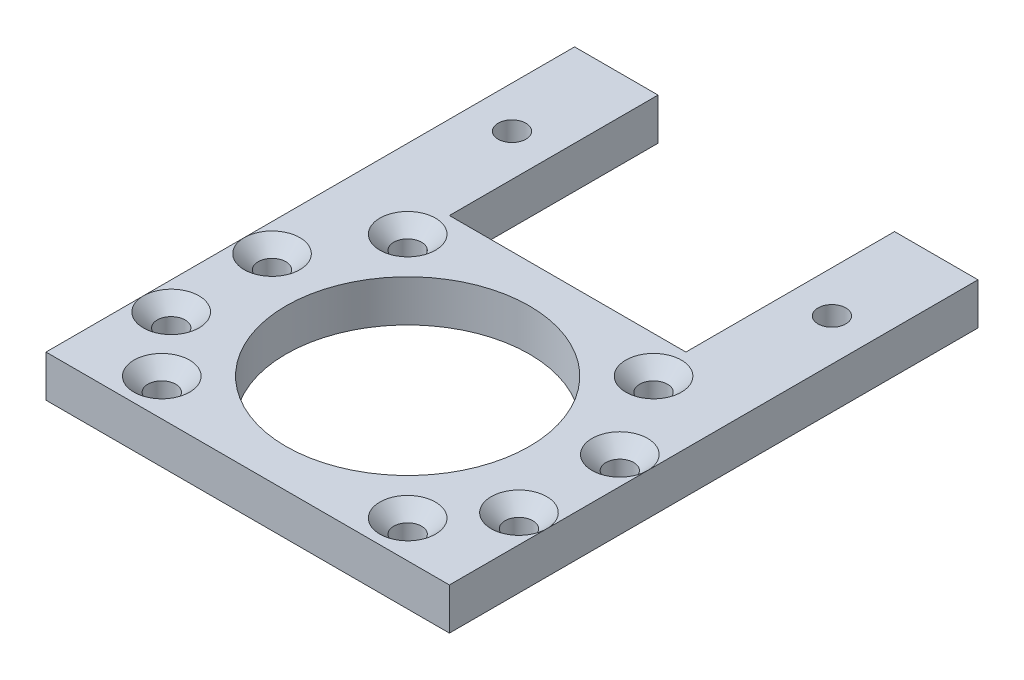
ISO-10303-21;
HEADER;
FILE_DESCRIPTION(('STEP AP214'),'2;1');
FILE_NAME('part.step','',(''),(''),'','','');
FILE_SCHEMA(('AUTOMOTIVE_DESIGN { 1 0 10303 214 1 1 1 1 }'));
ENDSEC;
DATA;
#1=APPLICATION_CONTEXT('core data for automotive mechanical design processes');
#2=APPLICATION_PROTOCOL_DEFINITION('international standard','automotive_design',2000,#1);
#3=PRODUCT_CONTEXT('',#1,'mechanical');
#4=PRODUCT('Part','Part','',(#3));
#5=PRODUCT_RELATED_PRODUCT_CATEGORY('part','',(#4));
#6=PRODUCT_DEFINITION_FORMATION('','',#4);
#7=PRODUCT_DEFINITION_CONTEXT('part definition',#1,'design');
#8=PRODUCT_DEFINITION('design','',#6,#7);
#9=PRODUCT_DEFINITION_SHAPE('','',#8);
#10=(LENGTH_UNIT() NAMED_UNIT(*) SI_UNIT(.MILLI.,.METRE.));
#11=(NAMED_UNIT(*) PLANE_ANGLE_UNIT() SI_UNIT($,.RADIAN.));
#12=(NAMED_UNIT(*) SI_UNIT($,.STERADIAN.) SOLID_ANGLE_UNIT());
#13=UNCERTAINTY_MEASURE_WITH_UNIT(LENGTH_MEASURE(1.E-05),#10,'distance_accuracy_value','');
#14=(GEOMETRIC_REPRESENTATION_CONTEXT(3) GLOBAL_UNCERTAINTY_ASSIGNED_CONTEXT((#13)) GLOBAL_UNIT_ASSIGNED_CONTEXT((#10,
#11,#12)) REPRESENTATION_CONTEXT('',''));
#15=CARTESIAN_POINT('',(0.,0.,0.));
#16=DIRECTION('',(0.,0.,1.));
#17=DIRECTION('',(1.,0.,0.));
#18=AXIS2_PLACEMENT_3D('',#15,#16,#17);
#19=CARTESIAN_POINT('',(0.,6.,-23.));
#20=DIRECTION('',(0.,0.,-1.));
#21=DIRECTION('',(-1.,0.,0.));
#22=AXIS2_PLACEMENT_3D('',#19,#20,#21);
#23=PLANE('',#22);
#24=DIRECTION('',(1.,0.,0.));
#25=VECTOR('',#24,1.);
#26=CARTESIAN_POINT('',(0.,6.,-23.));
#27=LINE('',#26,#25);
#28=CARTESIAN_POINT('',(-17.,6.,-23.));
#29=VERTEX_POINT('',#28);
#30=CARTESIAN_POINT('',(17.,6.,-23.));
#31=VERTEX_POINT('',#30);
#32=EDGE_CURVE('E132',#29,#31,#27,.T.);
#33=ORIENTED_EDGE('',*,*,#32,.T.);
#34=DIRECTION('',(0.,-1.,0.));
#35=VECTOR('',#34,1.);
#36=CARTESIAN_POINT('',(17.,38.310988842807,-23.));
#37=LINE('',#36,#35);
#38=CARTESIAN_POINT('',(17.,0.,-23.));
#39=VERTEX_POINT('',#38);
#40=EDGE_CURVE('E114',#31,#39,#37,.T.);
#41=ORIENTED_EDGE('',*,*,#40,.T.);
#42=DIRECTION('',(1.,0.,0.));
#43=VECTOR('',#42,1.);
#44=CARTESIAN_POINT('',(0.,0.,-23.));
#45=LINE('',#44,#43);
#46=CARTESIAN_POINT('',(-17.,0.,-23.));
#47=VERTEX_POINT('',#46);
#48=EDGE_CURVE('E181',#47,#39,#45,.T.);
#49=ORIENTED_EDGE('',*,*,#48,.F.);
#50=DIRECTION('',(0.,-1.,0.));
#51=VECTOR('',#50,1.);
#52=CARTESIAN_POINT('',(-17.,38.310988842807,-23.));
#53=LINE('',#52,#51);
#54=EDGE_CURVE('E139',#29,#47,#53,.T.);
#55=ORIENTED_EDGE('',*,*,#54,.F.);
#56=EDGE_LOOP('',(#33,#41,#49,#55));
#57=FACE_BOUND('',#56,.T.);
#58=ADVANCED_FACE('F38',(#57),#23,.T.);
#59=CARTESIAN_POINT('',(29.,6.,0.));
#60=DIRECTION('',(1.,0.,0.));
#61=DIRECTION('',(0.,0.,-1.));
#62=AXIS2_PLACEMENT_3D('',#59,#60,#61);
#63=PLANE('',#62);
#64=DIRECTION('',(0.,0.,1.));
#65=VECTOR('',#64,1.);
#66=CARTESIAN_POINT('',(29.,0.,0.));
#67=LINE('',#66,#65);
#68=CARTESIAN_POINT('',(29.,0.,-53.));
#69=VERTEX_POINT('',#68);
#70=CARTESIAN_POINT('',(29.,0.,23.));
#71=VERTEX_POINT('',#70);
#72=EDGE_CURVE('E178',#69,#71,#67,.T.);
#73=ORIENTED_EDGE('',*,*,#72,.F.);
#74=DIRECTION('',(0.,-1.,0.));
#75=VECTOR('',#74,1.);
#76=CARTESIAN_POINT('',(29.,38.310988842807,-53.));
#77=LINE('',#76,#75);
#78=CARTESIAN_POINT('',(29.,6.,-53.));
#79=VERTEX_POINT('',#78);
#80=EDGE_CURVE('E375',#79,#69,#77,.T.);
#81=ORIENTED_EDGE('',*,*,#80,.F.);
#82=DIRECTION('',(0.,0.,1.));
#83=VECTOR('',#82,1.);
#84=CARTESIAN_POINT('',(29.,6.,0.));
#85=LINE('',#84,#83);
#86=CARTESIAN_POINT('',(29.,6.,-5.50000000000001));
#87=VERTEX_POINT('',#86);
#88=EDGE_CURVE('E141',#79,#87,#85,.T.);
#89=ORIENTED_EDGE('',*,*,#88,.T.);
#90=CARTESIAN_POINT('',(29.,6.,8.99999999999999));
#91=VERTEX_POINT('',#90);
#92=EDGE_CURVE('E147',#87,#91,#85,.T.);
#93=ORIENTED_EDGE('',*,*,#92,.T.);
#94=CARTESIAN_POINT('',(29.,6.,23.));
#95=VERTEX_POINT('',#94);
#96=EDGE_CURVE('E149',#91,#95,#85,.T.);
#97=ORIENTED_EDGE('',*,*,#96,.T.);
#98=DIRECTION('',(0.,-1.,0.));
#99=VECTOR('',#98,1.);
#100=CARTESIAN_POINT('',(29.,6.,23.));
#101=LINE('',#100,#99);
#102=EDGE_CURVE('E156',#95,#71,#101,.T.);
#103=ORIENTED_EDGE('',*,*,#102,.T.);
#104=EDGE_LOOP('',(#73,#81,#89,#93,#97,#103));
#105=FACE_BOUND('',#104,.T.);
#106=ADVANCED_FACE('F255',(#105),#63,.T.);
#107=CARTESIAN_POINT('',(-29.,6.,0.));
#108=DIRECTION('',(1.,0.,0.));
#109=DIRECTION('',(0.,0.,-1.));
#110=AXIS2_PLACEMENT_3D('',#107,#108,#109);
#111=PLANE('',#110);
#112=DIRECTION('',(0.,0.,1.));
#113=VECTOR('',#112,1.);
#114=CARTESIAN_POINT('',(-29.,0.,0.));
#115=LINE('',#114,#113);
#116=CARTESIAN_POINT('',(-29.,0.,-53.));
#117=VERTEX_POINT('',#116);
#118=CARTESIAN_POINT('',(-29.,0.,23.));
#119=VERTEX_POINT('',#118);
#120=EDGE_CURVE('E183',#117,#119,#115,.T.);
#121=ORIENTED_EDGE('',*,*,#120,.T.);
#122=DIRECTION('',(0.,-1.,0.));
#123=VECTOR('',#122,1.);
#124=CARTESIAN_POINT('',(-29.,6.,23.));
#125=LINE('',#124,#123);
#126=CARTESIAN_POINT('',(-29.,6.,23.));
#127=VERTEX_POINT('',#126);
#128=EDGE_CURVE('E197',#127,#119,#125,.T.);
#129=ORIENTED_EDGE('',*,*,#128,.F.);
#130=DIRECTION('',(0.,0.,1.));
#131=VECTOR('',#130,1.);
#132=CARTESIAN_POINT('',(-29.,6.,0.));
#133=LINE('',#132,#131);
#134=CARTESIAN_POINT('',(-29.,6.,9.));
#135=VERTEX_POINT('',#134);
#136=EDGE_CURVE('E140',#135,#127,#133,.T.);
#137=ORIENTED_EDGE('',*,*,#136,.F.);
#138=CARTESIAN_POINT('',(-29.,6.,-5.5));
#139=VERTEX_POINT('',#138);
#140=EDGE_CURVE('E143',#139,#135,#133,.T.);
#141=ORIENTED_EDGE('',*,*,#140,.F.);
#142=CARTESIAN_POINT('',(-29.,6.,-53.));
#143=VERTEX_POINT('',#142);
#144=EDGE_CURVE('E145',#143,#139,#133,.T.);
#145=ORIENTED_EDGE('',*,*,#144,.F.);
#146=DIRECTION('',(0.,-1.,0.));
#147=VECTOR('',#146,1.);
#148=CARTESIAN_POINT('',(-29.,38.310988842807,-53.));
#149=LINE('',#148,#147);
#150=EDGE_CURVE('E393',#143,#117,#149,.T.);
#151=ORIENTED_EDGE('',*,*,#150,.T.);
#152=EDGE_LOOP('',(#121,#129,#137,#141,#145,#151));
#153=FACE_BOUND('',#152,.T.);
#154=ADVANCED_FACE('F260',(#153),#111,.F.);
#155=CARTESIAN_POINT('',(17.6776695296637,6.,17.6776695296637));
#156=DIRECTION('',(0.,-1.,0.));
#157=DIRECTION('',(0.,0.,-1.));
#158=AXIS2_PLACEMENT_3D('',#155,#156,#157);
#159=CYLINDRICAL_SURFACE('',#158,2.00000000000001);
#160=CARTESIAN_POINT('',(17.6776695296637,4.,17.6776695296637));
#161=DIRECTION('',(0.,1.,0.));
#162=DIRECTION('',(0.,0.,1.));
#163=AXIS2_PLACEMENT_3D('',#160,#161,#162);
#164=CIRCLE('',#163,2.00000000000001);
#165=CARTESIAN_POINT('',(17.6776695296637,4.,19.6776695296637));
#166=VERTEX_POINT('',#165);
#167=EDGE_CURVE('E229',#166,#166,#164,.T.);
#168=ORIENTED_EDGE('',*,*,#167,.T.);
#169=EDGE_LOOP('',(#168));
#170=FACE_BOUND('',#169,.T.);
#171=CARTESIAN_POINT('',(17.6776695296637,0.,17.6776695296637));
#172=DIRECTION('',(0.,1.,0.));
#173=DIRECTION('',(0.,0.,1.));
#174=AXIS2_PLACEMENT_3D('',#171,#172,#173);
#175=CIRCLE('',#174,2.00000000000001);
#176=CARTESIAN_POINT('',(17.6776695296637,0.,19.6776695296637));
#177=VERTEX_POINT('',#176);
#178=EDGE_CURVE('E189',#177,#177,#175,.F.);
#179=ORIENTED_EDGE('',*,*,#178,.T.);
#180=EDGE_LOOP('',(#179));
#181=FACE_BOUND('',#180,.T.);
#182=ADVANCED_FACE('F424',(#170,#181),#159,.F.);
#183=CARTESIAN_POINT('',(0.,6.,23.));
#184=DIRECTION('',(0.,0.,-1.));
#185=DIRECTION('',(-1.,0.,0.));
#186=AXIS2_PLACEMENT_3D('',#183,#184,#185);
#187=PLANE('',#186);
#188=DIRECTION('',(1.,0.,0.));
#189=VECTOR('',#188,1.);
#190=CARTESIAN_POINT('',(0.,0.,23.));
#191=LINE('',#190,#189);
#192=EDGE_CURVE('E186',#119,#71,#191,.T.);
#193=ORIENTED_EDGE('',*,*,#192,.T.);
#194=ORIENTED_EDGE('',*,*,#102,.F.);
#195=DIRECTION('',(1.,0.,0.));
#196=VECTOR('',#195,1.);
#197=CARTESIAN_POINT('',(0.,6.,23.));
#198=LINE('',#197,#196);
#199=EDGE_CURVE('E153',#127,#95,#198,.T.);
#200=ORIENTED_EDGE('',*,*,#199,.F.);
#201=ORIENTED_EDGE('',*,*,#128,.T.);
#202=EDGE_LOOP('',(#193,#194,#200,#201));
#203=FACE_BOUND('',#202,.T.);
#204=ADVANCED_FACE('F270',(#203),#187,.F.);
#205=CARTESIAN_POINT('',(0.,6.,0.));
#206=DIRECTION('',(0.,-1.,0.));
#207=DIRECTION('',(0.,0.,-1.));
#208=AXIS2_PLACEMENT_3D('',#205,#206,#207);
#209=CYLINDRICAL_SURFACE('',#208,17.5);
#210=CARTESIAN_POINT('',(0.,6.,0.));
#211=DIRECTION('',(0.,1.,0.));
#212=DIRECTION('',(0.,0.,1.));
#213=AXIS2_PLACEMENT_3D('',#210,#211,#212);
#214=CIRCLE('',#213,17.5);
#215=CARTESIAN_POINT('',(0.,6.,17.5));
#216=VERTEX_POINT('',#215);
#217=EDGE_CURVE('E195',#216,#216,#214,.T.);
#218=ORIENTED_EDGE('',*,*,#217,.T.);
#219=EDGE_LOOP('',(#218));
#220=FACE_BOUND('',#219,.T.);
#221=CARTESIAN_POINT('',(0.,0.,0.));
#222=DIRECTION('',(0.,1.,0.));
#223=DIRECTION('',(0.,0.,1.));
#224=AXIS2_PLACEMENT_3D('',#221,#222,#223);
#225=CIRCLE('',#224,17.5);
#226=CARTESIAN_POINT('',(0.,0.,17.5));
#227=VERTEX_POINT('',#226);
#228=EDGE_CURVE('E175',#227,#227,#225,.T.);
#229=ORIENTED_EDGE('',*,*,#228,.F.);
#230=EDGE_LOOP('',(#229));
#231=FACE_BOUND('',#230,.T.);
#232=ADVANCED_FACE('F266',(#220,#231),#209,.F.);
#233=CARTESIAN_POINT('',(-17.6776695296637,6.,-17.6776695296637));
#234=DIRECTION('',(0.,-1.,0.));
#235=DIRECTION('',(0.,0.,-1.));
#236=AXIS2_PLACEMENT_3D('',#233,#234,#235);
#237=CYLINDRICAL_SURFACE('',#236,2.);
#238=CARTESIAN_POINT('',(-17.6776695296637,3.99999999999997,-17.6776695296637));
#239=DIRECTION('',(0.,1.,0.));
#240=DIRECTION('',(0.,0.,1.));
#241=AXIS2_PLACEMENT_3D('',#238,#239,#240);
#242=CIRCLE('',#241,2.);
#243=CARTESIAN_POINT('',(-17.6776695296637,3.99999999999997,-15.6776695296637));
#244=VERTEX_POINT('',#243);
#245=EDGE_CURVE('E11',#244,#244,#242,.T.);
#246=ORIENTED_EDGE('',*,*,#245,.T.);
#247=EDGE_LOOP('',(#246));
#248=FACE_BOUND('',#247,.T.);
#249=CARTESIAN_POINT('',(-17.6776695296637,0.,-17.6776695296637));
#250=DIRECTION('',(0.,1.,0.));
#251=DIRECTION('',(0.,0.,1.));
#252=AXIS2_PLACEMENT_3D('',#249,#250,#251);
#253=CIRCLE('',#252,2.);
#254=CARTESIAN_POINT('',(-17.6776695296637,0.,-15.6776695296637));
#255=VERTEX_POINT('',#254);
#256=EDGE_CURVE('E172',#255,#255,#253,.T.);
#257=ORIENTED_EDGE('',*,*,#256,.F.);
#258=EDGE_LOOP('',(#257));
#259=FACE_BOUND('',#258,.T.);
#260=ADVANCED_FACE('F269',(#248,#259),#237,.F.);
#261=CARTESIAN_POINT('',(-17.6776695296637,6.,17.6776695296637));
#262=DIRECTION('',(0.,-1.,0.));
#263=DIRECTION('',(0.,0.,-1.));
#264=AXIS2_PLACEMENT_3D('',#261,#262,#263);
#265=CYLINDRICAL_SURFACE('',#264,2.);
#266=CARTESIAN_POINT('',(-17.6776695296637,3.99999999999998,17.6776695296637));
#267=DIRECTION('',(0.,1.,0.));
#268=DIRECTION('',(0.,0.,1.));
#269=AXIS2_PLACEMENT_3D('',#266,#267,#268);
#270=CIRCLE('',#269,2.);
#271=CARTESIAN_POINT('',(-17.6776695296637,3.99999999999998,19.6776695296637));
#272=VERTEX_POINT('',#271);
#273=EDGE_CURVE('E232',#272,#272,#270,.T.);
#274=ORIENTED_EDGE('',*,*,#273,.T.);
#275=EDGE_LOOP('',(#274));
#276=FACE_BOUND('',#275,.T.);
#277=CARTESIAN_POINT('',(-17.6776695296637,0.,17.6776695296637));
#278=DIRECTION('',(0.,1.,0.));
#279=DIRECTION('',(0.,0.,1.));
#280=AXIS2_PLACEMENT_3D('',#277,#278,#279);
#281=CIRCLE('',#280,2.);
#282=CARTESIAN_POINT('',(-17.6776695296637,0.,19.6776695296637));
#283=VERTEX_POINT('',#282);
#284=EDGE_CURVE('E169',#283,#283,#281,.T.);
#285=ORIENTED_EDGE('',*,*,#284,.F.);
#286=EDGE_LOOP('',(#285));
#287=FACE_BOUND('',#286,.T.);
#288=ADVANCED_FACE('F274',(#276,#287),#265,.F.);
#289=CARTESIAN_POINT('',(17.6776695296637,6.,-17.6776695296637));
#290=DIRECTION('',(0.,-1.,0.));
#291=DIRECTION('',(0.,0.,-1.));
#292=AXIS2_PLACEMENT_3D('',#289,#290,#291);
#293=CYLINDRICAL_SURFACE('',#292,2.00000000000001);
#294=CARTESIAN_POINT('',(17.6776695296637,4.,-17.6776695296637));
#295=DIRECTION('',(0.,1.,0.));
#296=DIRECTION('',(0.,0.,1.));
#297=AXIS2_PLACEMENT_3D('',#294,#295,#296);
#298=CIRCLE('',#297,2.00000000000001);
#299=CARTESIAN_POINT('',(17.6776695296637,4.,-15.6776695296637));
#300=VERTEX_POINT('',#299);
#301=EDGE_CURVE('E220',#300,#300,#298,.T.);
#302=ORIENTED_EDGE('',*,*,#301,.T.);
#303=EDGE_LOOP('',(#302));
#304=FACE_BOUND('',#303,.T.);
#305=CARTESIAN_POINT('',(17.6776695296637,0.,-17.6776695296637));
#306=DIRECTION('',(0.,1.,0.));
#307=DIRECTION('',(0.,0.,1.));
#308=AXIS2_PLACEMENT_3D('',#305,#306,#307);
#309=CIRCLE('',#308,2.00000000000001);
#310=CARTESIAN_POINT('',(17.6776695296637,0.,-15.6776695296637));
#311=VERTEX_POINT('',#310);
#312=EDGE_CURVE('E166',#311,#311,#309,.F.);
#313=ORIENTED_EDGE('',*,*,#312,.T.);
#314=EDGE_LOOP('',(#313));
#315=FACE_BOUND('',#314,.T.);
#316=ADVANCED_FACE('F278',(#304,#315),#293,.F.);
#317=CARTESIAN_POINT('',(-25.,6.,-5.5));
#318=DIRECTION('',(0.,-1.,0.));
#319=DIRECTION('',(0.,0.,-1.));
#320=AXIS2_PLACEMENT_3D('',#317,#318,#319);
#321=CYLINDRICAL_SURFACE('',#320,2.);
#322=CARTESIAN_POINT('',(-25.,3.99999999999998,-5.5));
#323=DIRECTION('',(0.,1.,0.));
#324=DIRECTION('',(0.,0.,1.));
#325=AXIS2_PLACEMENT_3D('',#322,#323,#324);
#326=CIRCLE('',#325,2.);
#327=CARTESIAN_POINT('',(-25.,3.99999999999998,-3.5));
#328=VERTEX_POINT('',#327);
#329=EDGE_CURVE('E47',#328,#328,#326,.T.);
#330=ORIENTED_EDGE('',*,*,#329,.T.);
#331=EDGE_LOOP('',(#330));
#332=FACE_BOUND('',#331,.T.);
#333=CARTESIAN_POINT('',(-25.,0.,-5.5));
#334=DIRECTION('',(0.,1.,0.));
#335=DIRECTION('',(0.,0.,1.));
#336=AXIS2_PLACEMENT_3D('',#333,#334,#335);
#337=CIRCLE('',#336,2.);
#338=CARTESIAN_POINT('',(-25.,0.,-3.5));
#339=VERTEX_POINT('',#338);
#340=EDGE_CURVE('E163',#339,#339,#337,.T.);
#341=ORIENTED_EDGE('',*,*,#340,.F.);
#342=EDGE_LOOP('',(#341));
#343=FACE_BOUND('',#342,.T.);
#344=ADVANCED_FACE('F240',(#332,#343),#321,.F.);
#345=CARTESIAN_POINT('',(-25.,6.,9.));
#346=DIRECTION('',(0.,-1.,0.));
#347=DIRECTION('',(0.,0.,-1.));
#348=AXIS2_PLACEMENT_3D('',#345,#346,#347);
#349=CYLINDRICAL_SURFACE('',#348,2.);
#350=CARTESIAN_POINT('',(-25.,3.99999999999998,9.));
#351=DIRECTION('',(0.,1.,0.));
#352=DIRECTION('',(0.,0.,1.));
#353=AXIS2_PLACEMENT_3D('',#350,#351,#352);
#354=CIRCLE('',#353,2.);
#355=CARTESIAN_POINT('',(-25.,3.99999999999998,11.));
#356=VERTEX_POINT('',#355);
#357=EDGE_CURVE('E235',#356,#356,#354,.T.);
#358=ORIENTED_EDGE('',*,*,#357,.T.);
#359=EDGE_LOOP('',(#358));
#360=FACE_BOUND('',#359,.T.);
#361=CARTESIAN_POINT('',(-25.,0.,9.));
#362=DIRECTION('',(0.,1.,0.));
#363=DIRECTION('',(0.,0.,1.));
#364=AXIS2_PLACEMENT_3D('',#361,#362,#363);
#365=CIRCLE('',#364,2.);
#366=CARTESIAN_POINT('',(-25.,0.,11.));
#367=VERTEX_POINT('',#366);
#368=EDGE_CURVE('E160',#367,#367,#365,.T.);
#369=ORIENTED_EDGE('',*,*,#368,.F.);
#370=EDGE_LOOP('',(#369));
#371=FACE_BOUND('',#370,.T.);
#372=ADVANCED_FACE('F285',(#360,#371),#349,.F.);
#373=CARTESIAN_POINT('',(25.,6.,8.99999999999999));
#374=DIRECTION('',(0.,-1.,0.));
#375=DIRECTION('',(0.,0.,-1.));
#376=AXIS2_PLACEMENT_3D('',#373,#374,#375);
#377=CYLINDRICAL_SURFACE('',#376,2.);
#378=CARTESIAN_POINT('',(25.,3.99999999999999,8.99999999999999));
#379=DIRECTION('',(0.,1.,0.));
#380=DIRECTION('',(0.,0.,1.));
#381=AXIS2_PLACEMENT_3D('',#378,#379,#380);
#382=CIRCLE('',#381,2.);
#383=CARTESIAN_POINT('',(25.,3.99999999999999,11.));
#384=VERTEX_POINT('',#383);
#385=EDGE_CURVE('E226',#384,#384,#382,.T.);
#386=ORIENTED_EDGE('',*,*,#385,.T.);
#387=EDGE_LOOP('',(#386));
#388=FACE_BOUND('',#387,.T.);
#389=CARTESIAN_POINT('',(25.,0.,8.99999999999999));
#390=DIRECTION('',(0.,1.,0.));
#391=DIRECTION('',(0.,0.,1.));
#392=AXIS2_PLACEMENT_3D('',#389,#390,#391);
#393=CIRCLE('',#392,2.);
#394=CARTESIAN_POINT('',(25.,0.,11.));
#395=VERTEX_POINT('',#394);
#396=EDGE_CURVE('E157',#395,#395,#393,.F.);
#397=ORIENTED_EDGE('',*,*,#396,.T.);
#398=EDGE_LOOP('',(#397));
#399=FACE_BOUND('',#398,.T.);
#400=ADVANCED_FACE('F288',(#388,#399),#377,.F.);
#401=CARTESIAN_POINT('',(25.,6.,-5.50000000000001));
#402=DIRECTION('',(0.,-1.,0.));
#403=DIRECTION('',(0.,0.,-1.));
#404=AXIS2_PLACEMENT_3D('',#401,#402,#403);
#405=CYLINDRICAL_SURFACE('',#404,2.);
#406=CARTESIAN_POINT('',(25.,3.99999999999999,-5.50000000000001));
#407=DIRECTION('',(0.,1.,0.));
#408=DIRECTION('',(0.,0.,1.));
#409=AXIS2_PLACEMENT_3D('',#406,#407,#408);
#410=CIRCLE('',#409,2.);
#411=CARTESIAN_POINT('',(25.,3.99999999999999,-3.5));
#412=VERTEX_POINT('',#411);
#413=EDGE_CURVE('E223',#412,#412,#410,.T.);
#414=ORIENTED_EDGE('',*,*,#413,.T.);
#415=EDGE_LOOP('',(#414));
#416=FACE_BOUND('',#415,.T.);
#417=CARTESIAN_POINT('',(25.,0.,-5.50000000000001));
#418=DIRECTION('',(0.,1.,0.));
#419=DIRECTION('',(0.,0.,1.));
#420=AXIS2_PLACEMENT_3D('',#417,#418,#419);
#421=CIRCLE('',#420,2.);
#422=CARTESIAN_POINT('',(25.,0.,-3.5));
#423=VERTEX_POINT('',#422);
#424=EDGE_CURVE('E192',#423,#423,#421,.F.);
#425=ORIENTED_EDGE('',*,*,#424,.T.);
#426=EDGE_LOOP('',(#425));
#427=FACE_BOUND('',#426,.T.);
#428=ADVANCED_FACE('F292',(#416,#427),#405,.F.);
#429=CARTESIAN_POINT('',(0.,6.,0.));
#430=DIRECTION('',(0.,1.,0.));
#431=DIRECTION('',(0.,0.,1.));
#432=AXIS2_PLACEMENT_3D('',#429,#430,#431);
#433=PLANE('',#432);
#434=CARTESIAN_POINT('',(17.6776695296637,6.,-17.6776695296637));
#435=DIRECTION('',(0.,1.,0.));
#436=DIRECTION('',(0.,0.,1.));
#437=AXIS2_PLACEMENT_3D('',#434,#435,#436);
#438=CIRCLE('',#437,4.00000000000002);
#439=CARTESIAN_POINT('',(17.6776695296637,6.,-13.6776695296637));
#440=VERTEX_POINT('',#439);
#441=EDGE_CURVE('E217',#440,#440,#438,.F.);
#442=ORIENTED_EDGE('',*,*,#441,.T.);
#443=EDGE_LOOP('',(#442));
#444=FACE_BOUND('',#443,.T.);
#445=CARTESIAN_POINT('',(17.6776695296637,6.,17.6776695296637));
#446=DIRECTION('',(0.,1.,0.));
#447=DIRECTION('',(0.,0.,1.));
#448=AXIS2_PLACEMENT_3D('',#445,#446,#447);
#449=CIRCLE('',#448,4.00000000000002);
#450=CARTESIAN_POINT('',(17.6776695296637,6.,21.6776695296637));
#451=VERTEX_POINT('',#450);
#452=EDGE_CURVE('E208',#451,#451,#449,.F.);
#453=ORIENTED_EDGE('',*,*,#452,.T.);
#454=EDGE_LOOP('',(#453));
#455=FACE_BOUND('',#454,.T.);
#456=CARTESIAN_POINT('',(-17.6776695296637,6.,17.6776695296637));
#457=DIRECTION('',(0.,1.,0.));
#458=DIRECTION('',(0.,0.,1.));
#459=AXIS2_PLACEMENT_3D('',#456,#457,#458);
#460=CIRCLE('',#459,4.00000000000002);
#461=CARTESIAN_POINT('',(-17.6776695296637,6.,21.6776695296637));
#462=VERTEX_POINT('',#461);
#463=EDGE_CURVE('E205',#462,#462,#460,.F.);
#464=ORIENTED_EDGE('',*,*,#463,.T.);
#465=EDGE_LOOP('',(#464));
#466=FACE_BOUND('',#465,.T.);
#467=CARTESIAN_POINT('',(-17.6776695296637,6.,-17.6776695296637));
#468=DIRECTION('',(0.,1.,0.));
#469=DIRECTION('',(0.,0.,1.));
#470=AXIS2_PLACEMENT_3D('',#467,#468,#469);
#471=CIRCLE('',#470,4.00000000000005);
#472=CARTESIAN_POINT('',(-17.6776695296637,6.,-13.6776695296637));
#473=VERTEX_POINT('',#472);
#474=EDGE_CURVE('E200',#473,#473,#471,.F.);
#475=ORIENTED_EDGE('',*,*,#474,.T.);
#476=EDGE_LOOP('',(#475));
#477=FACE_BOUND('',#476,.T.);
#478=ORIENTED_EDGE('',*,*,#217,.F.);
#479=EDGE_LOOP('',(#478));
#480=FACE_BOUND('',#479,.T.);
#481=ORIENTED_EDGE('',*,*,#92,.F.);
#482=CARTESIAN_POINT('',(25.,6.,-5.50000000000001));
#483=DIRECTION('',(0.,1.,0.));
#484=DIRECTION('',(0.,0.,1.));
#485=AXIS2_PLACEMENT_3D('',#482,#483,#484);
#486=CIRCLE('',#485,4.00000000000002);
#487=EDGE_CURVE('E214',#87,#87,#486,.F.);
#488=ORIENTED_EDGE('',*,*,#487,.T.);
#489=ORIENTED_EDGE('',*,*,#88,.F.);
#490=DIRECTION('',(-1.,0.,0.));
#491=VECTOR('',#490,1.);
#492=CARTESIAN_POINT('',(29.,6.,-53.));
#493=LINE('',#492,#491);
#494=CARTESIAN_POINT('',(17.,6.,-53.));
#495=VERTEX_POINT('',#494);
#496=EDGE_CURVE('E135',#79,#495,#493,.T.);
#497=ORIENTED_EDGE('',*,*,#496,.T.);
#498=DIRECTION('',(0.,0.,1.));
#499=VECTOR('',#498,1.);
#500=CARTESIAN_POINT('',(17.,6.,-23.));
#501=LINE('',#500,#499);
#502=EDGE_CURVE('E117',#495,#31,#501,.T.);
#503=ORIENTED_EDGE('',*,*,#502,.T.);
#504=ORIENTED_EDGE('',*,*,#32,.F.);
#505=DIRECTION('',(0.,0.,-1.));
#506=VECTOR('',#505,1.);
#507=CARTESIAN_POINT('',(-17.,6.,-23.));
#508=LINE('',#507,#506);
#509=CARTESIAN_POINT('',(-17.,6.,-53.));
#510=VERTEX_POINT('',#509);
#511=EDGE_CURVE('E384',#29,#510,#508,.T.);
#512=ORIENTED_EDGE('',*,*,#511,.T.);
#513=DIRECTION('',(-1.,0.,0.));
#514=VECTOR('',#513,1.);
#515=CARTESIAN_POINT('',(-29.,6.,-53.));
#516=LINE('',#515,#514);
#517=EDGE_CURVE('E381',#510,#143,#516,.T.);
#518=ORIENTED_EDGE('',*,*,#517,.T.);
#519=ORIENTED_EDGE('',*,*,#144,.T.);
#520=CARTESIAN_POINT('',(-25.,6.,-5.5));
#521=DIRECTION('',(0.,1.,0.));
#522=DIRECTION('',(0.,0.,1.));
#523=AXIS2_PLACEMENT_3D('',#520,#521,#522);
#524=CIRCLE('',#523,4.00000000000002);
#525=EDGE_CURVE('E57',#139,#139,#524,.F.);
#526=ORIENTED_EDGE('',*,*,#525,.T.);
#527=ORIENTED_EDGE('',*,*,#140,.T.);
#528=CARTESIAN_POINT('',(-25.,6.,9.));
#529=DIRECTION('',(0.,1.,0.));
#530=DIRECTION('',(0.,0.,1.));
#531=AXIS2_PLACEMENT_3D('',#528,#529,#530);
#532=CIRCLE('',#531,4.00000000000002);
#533=EDGE_CURVE('E52',#135,#135,#532,.F.);
#534=ORIENTED_EDGE('',*,*,#533,.T.);
#535=ORIENTED_EDGE('',*,*,#136,.T.);
#536=ORIENTED_EDGE('',*,*,#199,.T.);
#537=ORIENTED_EDGE('',*,*,#96,.F.);
#538=CARTESIAN_POINT('',(25.,6.,8.99999999999999));
#539=DIRECTION('',(0.,1.,0.));
#540=DIRECTION('',(0.,0.,1.));
#541=AXIS2_PLACEMENT_3D('',#538,#539,#540);
#542=CIRCLE('',#541,4.00000000000002);
#543=EDGE_CURVE('E211',#91,#91,#542,.F.);
#544=ORIENTED_EDGE('',*,*,#543,.T.);
#545=EDGE_LOOP('',(#481,#488,#489,#497,#503,#504,#512,#518,#519,#526,#527,#534,#535,#536,#537,#544));
#546=FACE_BOUND('',#545,.T.);
#547=CARTESIAN_POINT('',(-23.,6.,-38.));
#548=DIRECTION('',(0.,1.,0.));
#549=DIRECTION('',(0.,0.,1.));
#550=AXIS2_PLACEMENT_3D('',#547,#548,#549);
#551=CIRCLE('',#550,2.);
#552=CARTESIAN_POINT('',(-23.,6.,-36.));
#553=VERTEX_POINT('',#552);
#554=EDGE_CURVE('E378',#553,#553,#551,.T.);
#555=ORIENTED_EDGE('',*,*,#554,.F.);
#556=EDGE_LOOP('',(#555));
#557=FACE_BOUND('',#556,.T.);
#558=CARTESIAN_POINT('',(23.,6.,-38.));
#559=DIRECTION('',(0.,1.,0.));
#560=DIRECTION('',(0.,0.,1.));
#561=AXIS2_PLACEMENT_3D('',#558,#559,#560);
#562=CIRCLE('',#561,2.);
#563=CARTESIAN_POINT('',(23.,6.,-36.));
#564=VERTEX_POINT('',#563);
#565=EDGE_CURVE('E136',#564,#564,#562,.T.);
#566=ORIENTED_EDGE('',*,*,#565,.F.);
#567=EDGE_LOOP('',(#566));
#568=FACE_BOUND('',#567,.T.);
#569=ADVANCED_FACE('F129',(#444,#455,#466,#477,#480,#546,#557,#568),#433,.T.);
#570=CARTESIAN_POINT('',(0.,0.,0.));
#571=DIRECTION('',(0.,1.,0.));
#572=DIRECTION('',(0.,0.,1.));
#573=AXIS2_PLACEMENT_3D('',#570,#571,#572);
#574=PLANE('',#573);
#575=ORIENTED_EDGE('',*,*,#396,.F.);
#576=EDGE_LOOP('',(#575));
#577=FACE_BOUND('',#576,.T.);
#578=ORIENTED_EDGE('',*,*,#368,.T.);
#579=EDGE_LOOP('',(#578));
#580=FACE_BOUND('',#579,.T.);
#581=ORIENTED_EDGE('',*,*,#340,.T.);
#582=EDGE_LOOP('',(#581));
#583=FACE_BOUND('',#582,.T.);
#584=ORIENTED_EDGE('',*,*,#312,.F.);
#585=EDGE_LOOP('',(#584));
#586=FACE_BOUND('',#585,.T.);
#587=ORIENTED_EDGE('',*,*,#284,.T.);
#588=EDGE_LOOP('',(#587));
#589=FACE_BOUND('',#588,.T.);
#590=ORIENTED_EDGE('',*,*,#256,.T.);
#591=EDGE_LOOP('',(#590));
#592=FACE_BOUND('',#591,.T.);
#593=ORIENTED_EDGE('',*,*,#228,.T.);
#594=EDGE_LOOP('',(#593));
#595=FACE_BOUND('',#594,.T.);
#596=ORIENTED_EDGE('',*,*,#72,.T.);
#597=ORIENTED_EDGE('',*,*,#192,.F.);
#598=ORIENTED_EDGE('',*,*,#120,.F.);
#599=DIRECTION('',(-1.,0.,0.));
#600=VECTOR('',#599,1.);
#601=CARTESIAN_POINT('',(-29.,0.,-53.));
#602=LINE('',#601,#600);
#603=CARTESIAN_POINT('',(-17.,0.,-53.));
#604=VERTEX_POINT('',#603);
#605=EDGE_CURVE('E390',#604,#117,#602,.T.);
#606=ORIENTED_EDGE('',*,*,#605,.F.);
#607=DIRECTION('',(0.,0.,-1.));
#608=VECTOR('',#607,1.);
#609=CARTESIAN_POINT('',(-17.,0.,-23.));
#610=LINE('',#609,#608);
#611=EDGE_CURVE('E387',#47,#604,#610,.T.);
#612=ORIENTED_EDGE('',*,*,#611,.F.);
#613=ORIENTED_EDGE('',*,*,#48,.T.);
#614=DIRECTION('',(0.,0.,1.));
#615=VECTOR('',#614,1.);
#616=CARTESIAN_POINT('',(17.,0.,-23.));
#617=LINE('',#616,#615);
#618=CARTESIAN_POINT('',(17.,0.,-53.));
#619=VERTEX_POINT('',#618);
#620=EDGE_CURVE('E120',#619,#39,#617,.T.);
#621=ORIENTED_EDGE('',*,*,#620,.F.);
#622=DIRECTION('',(-1.,0.,0.));
#623=VECTOR('',#622,1.);
#624=CARTESIAN_POINT('',(29.,0.,-53.));
#625=LINE('',#624,#623);
#626=EDGE_CURVE('E367',#69,#619,#625,.T.);
#627=ORIENTED_EDGE('',*,*,#626,.F.);
#628=EDGE_LOOP('',(#596,#597,#598,#606,#612,#613,#621,#627));
#629=FACE_BOUND('',#628,.T.);
#630=ORIENTED_EDGE('',*,*,#178,.F.);
#631=EDGE_LOOP('',(#630));
#632=FACE_BOUND('',#631,.T.);
#633=ORIENTED_EDGE('',*,*,#424,.F.);
#634=EDGE_LOOP('',(#633));
#635=FACE_BOUND('',#634,.T.);
#636=CARTESIAN_POINT('',(-23.,0.,-38.));
#637=DIRECTION('',(0.,1.,0.));
#638=DIRECTION('',(0.,0.,1.));
#639=AXIS2_PLACEMENT_3D('',#636,#637,#638);
#640=CIRCLE('',#639,2.);
#641=CARTESIAN_POINT('',(-23.,0.,-36.));
#642=VERTEX_POINT('',#641);
#643=EDGE_CURVE('E362',#642,#642,#640,.T.);
#644=ORIENTED_EDGE('',*,*,#643,.T.);
#645=EDGE_LOOP('',(#644));
#646=FACE_BOUND('',#645,.T.);
#647=CARTESIAN_POINT('',(23.,0.,-38.));
#648=DIRECTION('',(0.,1.,0.));
#649=DIRECTION('',(0.,0.,-1.));
#650=AXIS2_PLACEMENT_3D('',#647,#648,#649);
#651=CIRCLE('',#650,2.);
#652=CARTESIAN_POINT('',(23.,0.,-40.));
#653=VERTEX_POINT('',#652);
#654=EDGE_CURVE('E365',#653,#653,#651,.T.);
#655=ORIENTED_EDGE('',*,*,#654,.T.);
#656=EDGE_LOOP('',(#655));
#657=FACE_BOUND('',#656,.T.);
#658=ADVANCED_FACE('F343',(#577,#580,#583,#586,#589,#592,#595,#629,#632,#635,#646,#657),#574,.F.);
#659=CARTESIAN_POINT('',(-29.,38.310988842807,-53.));
#660=DIRECTION('',(0.,0.,1.));
#661=DIRECTION('',(1.,0.,0.));
#662=AXIS2_PLACEMENT_3D('',#659,#660,#661);
#663=PLANE('',#662);
#664=ORIENTED_EDGE('',*,*,#517,.F.);
#665=DIRECTION('',(0.,-1.,0.));
#666=VECTOR('',#665,1.);
#667=CARTESIAN_POINT('',(-17.,38.310988842807,-53.));
#668=LINE('',#667,#666);
#669=EDGE_CURVE('E396',#510,#604,#668,.T.);
#670=ORIENTED_EDGE('',*,*,#669,.T.);
#671=ORIENTED_EDGE('',*,*,#605,.T.);
#672=ORIENTED_EDGE('',*,*,#150,.F.);
#673=EDGE_LOOP('',(#664,#670,#671,#672));
#674=FACE_BOUND('',#673,.T.);
#675=ADVANCED_FACE('F346',(#674),#663,.F.);
#676=CARTESIAN_POINT('',(-17.,38.310988842807,-23.));
#677=DIRECTION('',(-1.,0.,0.));
#678=DIRECTION('',(0.,0.,1.));
#679=AXIS2_PLACEMENT_3D('',#676,#677,#678);
#680=PLANE('',#679);
#681=ORIENTED_EDGE('',*,*,#511,.F.);
#682=ORIENTED_EDGE('',*,*,#54,.T.);
#683=ORIENTED_EDGE('',*,*,#611,.T.);
#684=ORIENTED_EDGE('',*,*,#669,.F.);
#685=EDGE_LOOP('',(#681,#682,#683,#684));
#686=FACE_BOUND('',#685,.T.);
#687=ADVANCED_FACE('F416',(#686),#680,.F.);
#688=CARTESIAN_POINT('',(-23.,38.310988842807,-38.));
#689=DIRECTION('',(0.,-1.,0.));
#690=DIRECTION('',(0.,0.,-1.));
#691=AXIS2_PLACEMENT_3D('',#688,#689,#690);
#692=CYLINDRICAL_SURFACE('',#691,2.);
#693=ORIENTED_EDGE('',*,*,#643,.F.);
#694=EDGE_LOOP('',(#693));
#695=FACE_BOUND('',#694,.T.);
#696=ORIENTED_EDGE('',*,*,#554,.T.);
#697=EDGE_LOOP('',(#696));
#698=FACE_BOUND('',#697,.T.);
#699=ADVANCED_FACE('F443',(#695,#698),#692,.F.);
#700=CARTESIAN_POINT('',(17.,38.310988842807,-23.));
#701=DIRECTION('',(1.,0.,0.));
#702=DIRECTION('',(0.,0.,-1.));
#703=AXIS2_PLACEMENT_3D('',#700,#701,#702);
#704=PLANE('',#703);
#705=ORIENTED_EDGE('',*,*,#502,.F.);
#706=DIRECTION('',(0.,-1.,0.));
#707=VECTOR('',#706,1.);
#708=CARTESIAN_POINT('',(17.,38.310988842807,-53.));
#709=LINE('',#708,#707);
#710=EDGE_CURVE('E124',#495,#619,#709,.T.);
#711=ORIENTED_EDGE('',*,*,#710,.T.);
#712=ORIENTED_EDGE('',*,*,#620,.T.);
#713=ORIENTED_EDGE('',*,*,#40,.F.);
#714=EDGE_LOOP('',(#705,#711,#712,#713));
#715=FACE_BOUND('',#714,.T.);
#716=ADVANCED_FACE('F116',(#715),#704,.F.);
#717=CARTESIAN_POINT('',(29.,38.310988842807,-53.));
#718=DIRECTION('',(0.,0.,1.));
#719=DIRECTION('',(1.,0.,0.));
#720=AXIS2_PLACEMENT_3D('',#717,#718,#719);
#721=PLANE('',#720);
#722=ORIENTED_EDGE('',*,*,#496,.F.);
#723=ORIENTED_EDGE('',*,*,#80,.T.);
#724=ORIENTED_EDGE('',*,*,#626,.T.);
#725=ORIENTED_EDGE('',*,*,#710,.F.);
#726=EDGE_LOOP('',(#722,#723,#724,#725));
#727=FACE_BOUND('',#726,.T.);
#728=ADVANCED_FACE('F412',(#727),#721,.F.);
#729=CARTESIAN_POINT('',(23.,38.310988842807,-38.));
#730=DIRECTION('',(0.,-1.,0.));
#731=DIRECTION('',(0.,0.,-1.));
#732=AXIS2_PLACEMENT_3D('',#729,#730,#731);
#733=CYLINDRICAL_SURFACE('',#732,2.);
#734=ORIENTED_EDGE('',*,*,#654,.F.);
#735=EDGE_LOOP('',(#734));
#736=FACE_BOUND('',#735,.T.);
#737=ORIENTED_EDGE('',*,*,#565,.T.);
#738=EDGE_LOOP('',(#737));
#739=FACE_BOUND('',#738,.T.);
#740=ADVANCED_FACE('F302',(#736,#739),#733,.F.);
#741=CARTESIAN_POINT('',(17.6776695296637,6.,-17.6776695296637));
#742=DIRECTION('',(0.,1.,0.));
#743=DIRECTION('',(0.,0.,1.));
#744=AXIS2_PLACEMENT_3D('',#741,#742,#743);
#745=CONICAL_SURFACE('',#744,4.00000000000002,0.785398163397451);
#746=ORIENTED_EDGE('',*,*,#301,.F.);
#747=EDGE_LOOP('',(#746));
#748=FACE_BOUND('',#747,.T.);
#749=ORIENTED_EDGE('',*,*,#441,.F.);
#750=EDGE_LOOP('',(#749));
#751=FACE_BOUND('',#750,.T.);
#752=ADVANCED_FACE('F295',(#748,#751),#745,.F.);
#753=CARTESIAN_POINT('',(25.,6.,-5.50000000000001));
#754=DIRECTION('',(0.,1.,0.));
#755=DIRECTION('',(0.,0.,1.));
#756=AXIS2_PLACEMENT_3D('',#753,#754,#755);
#757=CONICAL_SURFACE('',#756,4.00000000000002,0.78539816339745);
#758=ORIENTED_EDGE('',*,*,#413,.F.);
#759=EDGE_LOOP('',(#758));
#760=FACE_BOUND('',#759,.T.);
#761=ORIENTED_EDGE('',*,*,#487,.F.);
#762=EDGE_LOOP('',(#761));
#763=FACE_BOUND('',#762,.T.);
#764=ADVANCED_FACE('F301',(#760,#763),#757,.F.);
#765=CARTESIAN_POINT('',(25.,6.,8.99999999999999));
#766=DIRECTION('',(0.,1.,0.));
#767=DIRECTION('',(0.,0.,1.));
#768=AXIS2_PLACEMENT_3D('',#765,#766,#767);
#769=CONICAL_SURFACE('',#768,4.00000000000002,0.78539816339745);
#770=ORIENTED_EDGE('',*,*,#385,.F.);
#771=EDGE_LOOP('',(#770));
#772=FACE_BOUND('',#771,.T.);
#773=ORIENTED_EDGE('',*,*,#543,.F.);
#774=EDGE_LOOP('',(#773));
#775=FACE_BOUND('',#774,.T.);
#776=ADVANCED_FACE('F309',(#772,#775),#769,.F.);
#777=CARTESIAN_POINT('',(17.6776695296637,6.,17.6776695296637));
#778=DIRECTION('',(0.,1.,0.));
#779=DIRECTION('',(0.,0.,1.));
#780=AXIS2_PLACEMENT_3D('',#777,#778,#779);
#781=CONICAL_SURFACE('',#780,4.00000000000002,0.785398163397451);
#782=ORIENTED_EDGE('',*,*,#167,.F.);
#783=EDGE_LOOP('',(#782));
#784=FACE_BOUND('',#783,.T.);
#785=ORIENTED_EDGE('',*,*,#452,.F.);
#786=EDGE_LOOP('',(#785));
#787=FACE_BOUND('',#786,.T.);
#788=ADVANCED_FACE('F316',(#784,#787),#781,.F.);
#789=CARTESIAN_POINT('',(-17.6776695296637,3.99999999999998,17.6776695296637));
#790=DIRECTION('',(0.,1.,0.));
#791=DIRECTION('',(0.,0.,1.));
#792=AXIS2_PLACEMENT_3D('',#789,#790,#791);
#793=CONICAL_SURFACE('',#792,2.,0.785398163397447);
#794=ORIENTED_EDGE('',*,*,#463,.F.);
#795=EDGE_LOOP('',(#794));
#796=FACE_BOUND('',#795,.T.);
#797=ORIENTED_EDGE('',*,*,#273,.F.);
#798=EDGE_LOOP('',(#797));
#799=FACE_BOUND('',#798,.T.);
#800=ADVANCED_FACE('F251',(#796,#799),#793,.F.);
#801=CARTESIAN_POINT('',(-25.,3.99999999999998,9.));
#802=DIRECTION('',(0.,1.,0.));
#803=DIRECTION('',(0.,0.,1.));
#804=AXIS2_PLACEMENT_3D('',#801,#802,#803);
#805=CONICAL_SURFACE('',#804,2.,0.785398163397447);
#806=ORIENTED_EDGE('',*,*,#533,.F.);
#807=EDGE_LOOP('',(#806));
#808=FACE_BOUND('',#807,.T.);
#809=ORIENTED_EDGE('',*,*,#357,.F.);
#810=EDGE_LOOP('',(#809));
#811=FACE_BOUND('',#810,.T.);
#812=ADVANCED_FACE('F245',(#808,#811),#805,.F.);
#813=CARTESIAN_POINT('',(-25.,3.99999999999998,-5.5));
#814=DIRECTION('',(0.,1.,0.));
#815=DIRECTION('',(0.,0.,1.));
#816=AXIS2_PLACEMENT_3D('',#813,#814,#815);
#817=CONICAL_SURFACE('',#816,2.,0.785398163397447);
#818=ORIENTED_EDGE('',*,*,#525,.F.);
#819=EDGE_LOOP('',(#818));
#820=FACE_BOUND('',#819,.T.);
#821=ORIENTED_EDGE('',*,*,#329,.F.);
#822=EDGE_LOOP('',(#821));
#823=FACE_BOUND('',#822,.T.);
#824=ADVANCED_FACE('F243',(#820,#823),#817,.F.);
#825=CARTESIAN_POINT('',(-17.6776695296637,3.99999999999997,-17.6776695296637));
#826=DIRECTION('',(0.,1.,0.));
#827=DIRECTION('',(0.,0.,1.));
#828=AXIS2_PLACEMENT_3D('',#825,#826,#827);
#829=CONICAL_SURFACE('',#828,2.,0.78539816339745);
#830=ORIENTED_EDGE('',*,*,#474,.F.);
#831=EDGE_LOOP('',(#830));
#832=FACE_BOUND('',#831,.T.);
#833=ORIENTED_EDGE('',*,*,#245,.F.);
#834=EDGE_LOOP('',(#833));
#835=FACE_BOUND('',#834,.T.);
#836=ADVANCED_FACE('F41',(#832,#835),#829,.F.);
#837=CLOSED_SHELL('',(#58,#106,#154,#182,#204,#232,#260,#288,#316,#344,#372,#400,#428,#569,#658,
#675,#687,#699,#716,#728,#740,#752,#764,#776,#788,#800,#812,#824,#836));
#838=MANIFOLD_SOLID_BREP('B2',#837);
#839=ADVANCED_BREP_SHAPE_REPRESENTATION('',(#18,#838),#14);
#840=SHAPE_DEFINITION_REPRESENTATION(#9,#839);
ENDSEC;
END-ISO-10303-21;
